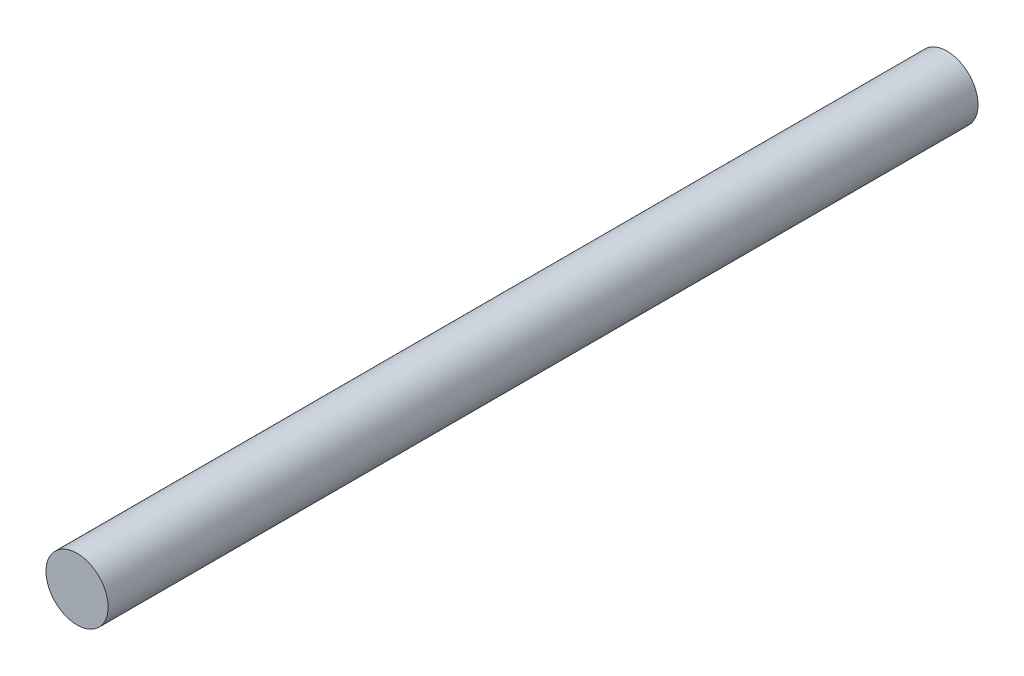
ISO-10303-21;
HEADER;
FILE_DESCRIPTION(('STEP AP214'),'2;1');
FILE_NAME('part.step','',(''),(''),'','','');
FILE_SCHEMA(('AUTOMOTIVE_DESIGN { 1 0 10303 214 1 1 1 1 }'));
ENDSEC;
DATA;
#1=APPLICATION_CONTEXT('core data for automotive mechanical design processes');
#2=APPLICATION_PROTOCOL_DEFINITION('international standard','automotive_design',2000,#1);
#3=PRODUCT_CONTEXT('',#1,'mechanical');
#4=PRODUCT('Part','Part','',(#3));
#5=PRODUCT_RELATED_PRODUCT_CATEGORY('part','',(#4));
#6=PRODUCT_DEFINITION_FORMATION('','',#4);
#7=PRODUCT_DEFINITION_CONTEXT('part definition',#1,'design');
#8=PRODUCT_DEFINITION('design','',#6,#7);
#9=PRODUCT_DEFINITION_SHAPE('','',#8);
#10=(LENGTH_UNIT() NAMED_UNIT(*) SI_UNIT(.MILLI.,.METRE.));
#11=(NAMED_UNIT(*) PLANE_ANGLE_UNIT() SI_UNIT($,.RADIAN.));
#12=(NAMED_UNIT(*) SI_UNIT($,.STERADIAN.) SOLID_ANGLE_UNIT());
#13=UNCERTAINTY_MEASURE_WITH_UNIT(LENGTH_MEASURE(1.E-05),#10,'distance_accuracy_value','');
#14=(GEOMETRIC_REPRESENTATION_CONTEXT(3) GLOBAL_UNCERTAINTY_ASSIGNED_CONTEXT((#13)) GLOBAL_UNIT_ASSIGNED_CONTEXT((#10,
#11,#12)) REPRESENTATION_CONTEXT('',''));
#15=CARTESIAN_POINT('',(0.,0.,0.));
#16=DIRECTION('',(0.,0.,1.));
#17=DIRECTION('',(1.,0.,0.));
#18=AXIS2_PLACEMENT_3D('',#15,#16,#17);
#19=CARTESIAN_POINT('',(17.399,2.54,4.96731269327044));
#20=DIRECTION('',(0.,0.,-1.));
#21=DIRECTION('',(-1.,0.,0.));
#22=AXIS2_PLACEMENT_3D('',#19,#20,#21);
#23=CYLINDRICAL_SURFACE('',#22,1.397);
#24=CARTESIAN_POINT('',(17.399,2.54,0.507999999999998));
#25=DIRECTION('',(0.,0.,-1.));
#26=DIRECTION('',(-1.,0.,0.));
#27=AXIS2_PLACEMENT_3D('',#24,#25,#26);
#28=CIRCLE('',#27,1.397);
#29=CARTESIAN_POINT('',(16.002,2.54,0.507999999999998));
#30=VERTEX_POINT('',#29);
#31=EDGE_CURVE('E10',#30,#30,#28,.F.);
#32=ORIENTED_EDGE('',*,*,#31,.F.);
#33=EDGE_LOOP('',(#32));
#34=FACE_BOUND('',#33,.T.);
#35=CARTESIAN_POINT('',(17.399,2.54,-38.608));
#36=DIRECTION('',(0.,0.,-1.));
#37=DIRECTION('',(-1.,0.,0.));
#38=AXIS2_PLACEMENT_3D('',#35,#36,#37);
#39=CIRCLE('',#38,1.397);
#40=CARTESIAN_POINT('',(16.002,2.54,-38.608));
#41=VERTEX_POINT('',#40);
#42=EDGE_CURVE('E45',#41,#41,#39,.T.);
#43=ORIENTED_EDGE('',*,*,#42,.F.);
#44=EDGE_LOOP('',(#43));
#45=FACE_BOUND('',#44,.T.);
#46=ADVANCED_FACE('F39',(#34,#45),#23,.T.);
#47=CARTESIAN_POINT('',(17.399,2.54,-38.608));
#48=DIRECTION('',(0.,0.,-1.));
#49=DIRECTION('',(-1.,0.,0.));
#50=AXIS2_PLACEMENT_3D('',#47,#48,#49);
#51=PLANE('',#50);
#52=ORIENTED_EDGE('',*,*,#42,.T.);
#53=EDGE_LOOP('',(#52));
#54=FACE_BOUND('',#53,.T.);
#55=ADVANCED_FACE('F51',(#54),#51,.T.);
#56=CARTESIAN_POINT('',(0.,1.0922,0.508000000000002));
#57=DIRECTION('',(0.,0.,-1.));
#58=DIRECTION('',(-1.,0.,0.));
#59=AXIS2_PLACEMENT_3D('',#56,#57,#58);
#60=PLANE('',#59);
#61=ORIENTED_EDGE('',*,*,#31,.T.);
#62=EDGE_LOOP('',(#61));
#63=FACE_BOUND('',#62,.T.);
#64=ADVANCED_FACE('F58',(#63),#60,.F.);
#65=CLOSED_SHELL('',(#46,#55,#64));
#66=MANIFOLD_SOLID_BREP('B2',#65);
#67=ADVANCED_BREP_SHAPE_REPRESENTATION('',(#18,#66),#14);
#68=SHAPE_DEFINITION_REPRESENTATION(#9,#67);
ENDSEC;
END-ISO-10303-21;
